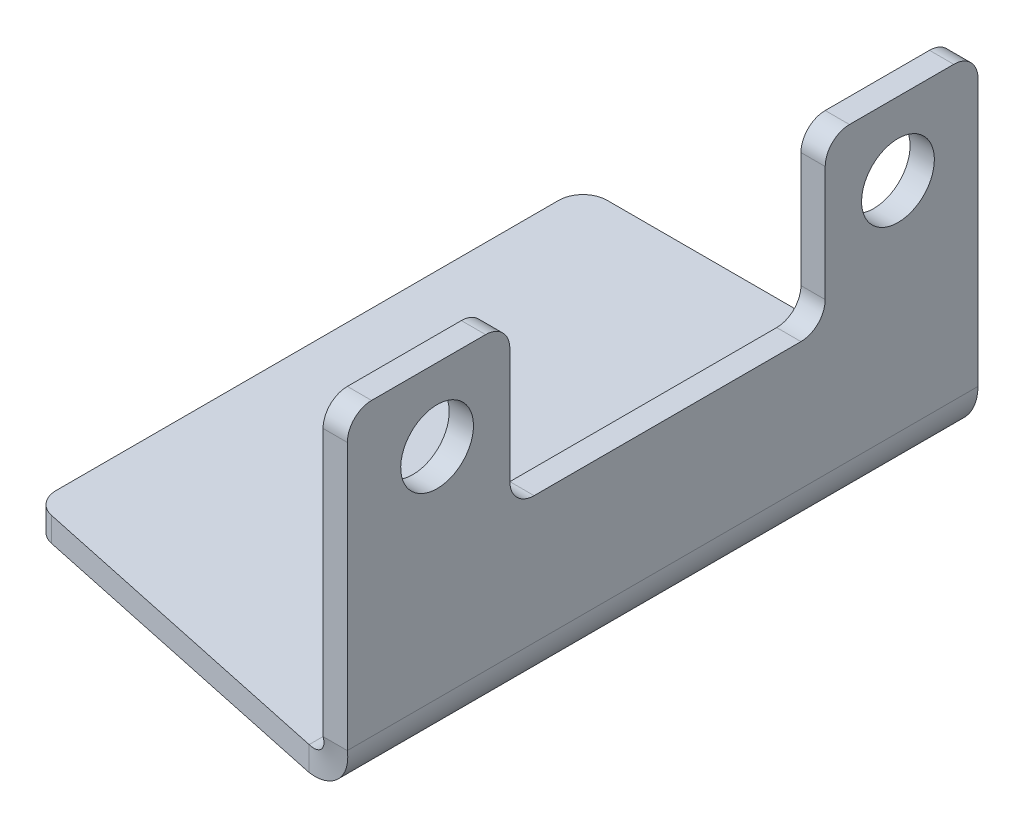
ISO-10303-21;
HEADER;
FILE_DESCRIPTION(('STEP AP214'),'2;1');
FILE_NAME('part.step','',(''),(''),'','','');
FILE_SCHEMA(('AUTOMOTIVE_DESIGN { 1 0 10303 214 1 1 1 1 }'));
ENDSEC;
DATA;
#1=APPLICATION_CONTEXT('core data for automotive mechanical design processes');
#2=APPLICATION_PROTOCOL_DEFINITION('international standard','automotive_design',2000,#1);
#3=PRODUCT_CONTEXT('',#1,'mechanical');
#4=PRODUCT('Part','Part','',(#3));
#5=PRODUCT_RELATED_PRODUCT_CATEGORY('part','',(#4));
#6=PRODUCT_DEFINITION_FORMATION('','',#4);
#7=PRODUCT_DEFINITION_CONTEXT('part definition',#1,'design');
#8=PRODUCT_DEFINITION('design','',#6,#7);
#9=PRODUCT_DEFINITION_SHAPE('','',#8);
#10=(LENGTH_UNIT() NAMED_UNIT(*) SI_UNIT(.MILLI.,.METRE.));
#11=(NAMED_UNIT(*) PLANE_ANGLE_UNIT() SI_UNIT($,.RADIAN.));
#12=(NAMED_UNIT(*) SI_UNIT($,.STERADIAN.) SOLID_ANGLE_UNIT());
#13=UNCERTAINTY_MEASURE_WITH_UNIT(LENGTH_MEASURE(1.E-05),#10,'distance_accuracy_value','');
#14=(GEOMETRIC_REPRESENTATION_CONTEXT(3) GLOBAL_UNCERTAINTY_ASSIGNED_CONTEXT((#13)) GLOBAL_UNIT_ASSIGNED_CONTEXT((#10,
#11,#12)) REPRESENTATION_CONTEXT('',''));
#15=CARTESIAN_POINT('',(0.,0.,0.));
#16=DIRECTION('',(0.,0.,1.));
#17=DIRECTION('',(1.,0.,0.));
#18=AXIS2_PLACEMENT_3D('',#15,#16,#17);
#19=CARTESIAN_POINT('',(54.3420683358524,-2.06531244947266E-13,0.));
#20=DIRECTION('',(-1.,0.,0.));
#21=DIRECTION('',(0.,-1.,0.));
#22=AXIS2_PLACEMENT_3D('',#19,#20,#21);
#23=PLANE('',#22);
#24=CARTESIAN_POINT('',(54.3420683358525,9.99999999999999,28.8693821128302));
#25=DIRECTION('',(-1.,0.,0.));
#26=DIRECTION('',(0.,-1.,0.));
#27=AXIS2_PLACEMENT_3D('',#24,#25,#26);
#28=CIRCLE('',#27,1.5);
#29=CARTESIAN_POINT('',(54.3420683358525,8.49999999999999,28.8693821128302));
#30=VERTEX_POINT('',#29);
#31=EDGE_CURVE('E244',#30,#30,#28,.T.);
#32=ORIENTED_EDGE('',*,*,#31,.T.);
#33=EDGE_LOOP('',(#32));
#34=FACE_BOUND('',#33,.T.);
#35=CARTESIAN_POINT('',(54.3420683358525,9.99999999999999,47.8693821128302));
#36=DIRECTION('',(-1.,0.,0.));
#37=DIRECTION('',(0.,-1.,0.));
#38=AXIS2_PLACEMENT_3D('',#35,#36,#37);
#39=CIRCLE('',#38,1.5);
#40=CARTESIAN_POINT('',(54.3420683358524,8.49999999999998,47.8693821128302));
#41=VERTEX_POINT('',#40);
#42=EDGE_CURVE('E405',#41,#41,#39,.T.);
#43=ORIENTED_EDGE('',*,*,#42,.T.);
#44=EDGE_LOOP('',(#43));
#45=FACE_BOUND('',#44,.T.);
#46=DIRECTION('',(0.,1.,0.));
#47=VECTOR('',#46,1.);
#48=CARTESIAN_POINT('',(54.3420683358524,-20.,25.57));
#49=LINE('',#48,#47);
#50=CARTESIAN_POINT('',(54.3420683358524,0.999999999999991,25.57));
#51=VERTEX_POINT('',#50);
#52=CARTESIAN_POINT('',(54.3420683358525,12.,25.57));
#53=VERTEX_POINT('',#52);
#54=EDGE_CURVE('E204',#51,#53,#49,.T.);
#55=ORIENTED_EDGE('',*,*,#54,.T.);
#56=CARTESIAN_POINT('',(54.3420683358525,12.,26.57));
#57=DIRECTION('',(-1.,0.,0.));
#58=DIRECTION('',(0.,-1.,0.));
#59=AXIS2_PLACEMENT_3D('',#56,#57,#58);
#60=CIRCLE('',#59,1.);
#61=CARTESIAN_POINT('',(54.3420683358525,13.,26.57));
#62=VERTEX_POINT('',#61);
#63=EDGE_CURVE('E362',#53,#62,#60,.F.);
#64=ORIENTED_EDGE('',*,*,#63,.T.);
#65=DIRECTION('',(0.,0.,1.));
#66=VECTOR('',#65,1.);
#67=CARTESIAN_POINT('',(54.3420683358525,13.,0.));
#68=LINE('',#67,#66);
#69=CARTESIAN_POINT('',(54.3420683358525,13.,30.8693821128302));
#70=VERTEX_POINT('',#69);
#71=EDGE_CURVE('E353',#62,#70,#68,.T.);
#72=ORIENTED_EDGE('',*,*,#71,.T.);
#73=CARTESIAN_POINT('',(54.3420683358525,12.,30.8693821128302));
#74=DIRECTION('',(-1.,0.,0.));
#75=DIRECTION('',(0.,-1.,0.));
#76=AXIS2_PLACEMENT_3D('',#73,#74,#75);
#77=CIRCLE('',#76,1.);
#78=CARTESIAN_POINT('',(54.3420683358525,12.,31.8693821128302));
#79=VERTEX_POINT('',#78);
#80=EDGE_CURVE('E463',#70,#79,#77,.F.);
#81=ORIENTED_EDGE('',*,*,#80,.T.);
#82=DIRECTION('',(0.,-1.,0.));
#83=VECTOR('',#82,1.);
#84=CARTESIAN_POINT('',(54.3420683358524,-2.06531244947266E-13,31.8693821128302));
#85=LINE('',#84,#83);
#86=CARTESIAN_POINT('',(54.3420683358524,7.25,31.8693821128302));
#87=VERTEX_POINT('',#86);
#88=EDGE_CURVE('E420',#79,#87,#85,.T.);
#89=ORIENTED_EDGE('',*,*,#88,.T.);
#90=CARTESIAN_POINT('',(54.3420683358524,7.25,32.8693821128302));
#91=DIRECTION('',(-1.,0.,0.));
#92=DIRECTION('',(0.,-1.,0.));
#93=AXIS2_PLACEMENT_3D('',#90,#91,#92);
#94=CIRCLE('',#93,1.);
#95=CARTESIAN_POINT('',(54.3420683358524,6.25,32.8693821128302));
#96=VERTEX_POINT('',#95);
#97=EDGE_CURVE('E486',#87,#96,#94,.T.);
#98=ORIENTED_EDGE('',*,*,#97,.T.);
#99=DIRECTION('',(0.,0.,-1.));
#100=VECTOR('',#99,1.);
#101=CARTESIAN_POINT('',(54.3420683358524,6.25,0.));
#102=LINE('',#101,#100);
#103=CARTESIAN_POINT('',(54.3420683358524,6.25000000000001,43.8693821128302));
#104=VERTEX_POINT('',#103);
#105=EDGE_CURVE('E412',#104,#96,#102,.T.);
#106=ORIENTED_EDGE('',*,*,#105,.F.);
#107=CARTESIAN_POINT('',(54.3420683358524,7.25000000000001,43.8693821128302));
#108=DIRECTION('',(-1.,0.,0.));
#109=DIRECTION('',(0.,-1.,0.));
#110=AXIS2_PLACEMENT_3D('',#107,#108,#109);
#111=CIRCLE('',#110,1.);
#112=CARTESIAN_POINT('',(54.3420683358524,7.25000000000001,44.8693821128302));
#113=VERTEX_POINT('',#112);
#114=EDGE_CURVE('E365',#104,#113,#111,.T.);
#115=ORIENTED_EDGE('',*,*,#114,.T.);
#116=DIRECTION('',(0.,-1.,0.));
#117=VECTOR('',#116,1.);
#118=CARTESIAN_POINT('',(54.3420683358524,-2.06531244947266E-13,44.8693821128302));
#119=LINE('',#118,#117);
#120=CARTESIAN_POINT('',(54.3420683358525,12.,44.8693821128302));
#121=VERTEX_POINT('',#120);
#122=EDGE_CURVE('E417',#121,#113,#119,.T.);
#123=ORIENTED_EDGE('',*,*,#122,.F.);
#124=CARTESIAN_POINT('',(54.3420683358525,12.,45.8693821128302));
#125=DIRECTION('',(-1.,0.,0.));
#126=DIRECTION('',(0.,-1.,0.));
#127=AXIS2_PLACEMENT_3D('',#124,#125,#126);
#128=CIRCLE('',#127,1.);
#129=CARTESIAN_POINT('',(54.3420683358525,13.,45.8693821128302));
#130=VERTEX_POINT('',#129);
#131=EDGE_CURVE('E465',#121,#130,#128,.F.);
#132=ORIENTED_EDGE('',*,*,#131,.T.);
#133=CARTESIAN_POINT('',(54.3420683358525,13.,50.5693821128302));
#134=VERTEX_POINT('',#133);
#135=EDGE_CURVE('E360',#130,#134,#68,.T.);
#136=ORIENTED_EDGE('',*,*,#135,.T.);
#137=CARTESIAN_POINT('',(54.3420683358525,12.,50.5693821128302));
#138=DIRECTION('',(-1.,0.,0.));
#139=DIRECTION('',(0.,-1.,0.));
#140=AXIS2_PLACEMENT_3D('',#137,#138,#139);
#141=CIRCLE('',#140,1.);
#142=CARTESIAN_POINT('',(54.3420683358525,12.,51.5693821128302));
#143=VERTEX_POINT('',#142);
#144=EDGE_CURVE('E376',#134,#143,#141,.F.);
#145=ORIENTED_EDGE('',*,*,#144,.T.);
#146=DIRECTION('',(0.,-1.,0.));
#147=VECTOR('',#146,1.);
#148=CARTESIAN_POINT('',(54.3420683358524,-2.06531244947266E-13,51.5693821128302));
#149=LINE('',#148,#147);
#150=CARTESIAN_POINT('',(54.3420683358524,0.99999999999999,51.5693821128302));
#151=VERTEX_POINT('',#150);
#152=EDGE_CURVE('E230',#143,#151,#149,.T.);
#153=ORIENTED_EDGE('',*,*,#152,.T.);
#154=DIRECTION('',(0.,0.,-1.));
#155=VECTOR('',#154,1.);
#156=CARTESIAN_POINT('',(54.3420683358524,0.99999999999999,51.5693821128302));
#157=LINE('',#156,#155);
#158=EDGE_CURVE('E222',#51,#151,#157,.F.);
#159=ORIENTED_EDGE('',*,*,#158,.F.);
#160=EDGE_LOOP('',(#55,#64,#72,#81,#89,#98,#106,#115,#123,#132,#136,#145,#153,#159));
#161=FACE_BOUND('',#160,.T.);
#162=ADVANCED_FACE('F68',(#34,#45,#161),#23,.F.);
#163=CARTESIAN_POINT('',(53.3420683358524,-2.03039763608423E-13,0.));
#164=DIRECTION('',(-1.,0.,0.));
#165=DIRECTION('',(0.,-1.,0.));
#166=AXIS2_PLACEMENT_3D('',#163,#164,#165);
#167=PLANE('',#166);
#168=CARTESIAN_POINT('',(53.3420683358525,9.99999999999999,28.8693821128302));
#169=DIRECTION('',(-1.,0.,0.));
#170=DIRECTION('',(0.,-1.,0.));
#171=AXIS2_PLACEMENT_3D('',#168,#169,#170);
#172=CIRCLE('',#171,1.5);
#173=CARTESIAN_POINT('',(53.3420683358525,8.49999999999999,28.8693821128302));
#174=VERTEX_POINT('',#173);
#175=EDGE_CURVE('E408',#174,#174,#172,.T.);
#176=ORIENTED_EDGE('',*,*,#175,.F.);
#177=EDGE_LOOP('',(#176));
#178=FACE_BOUND('',#177,.T.);
#179=CARTESIAN_POINT('',(53.3420683358525,9.99999999999999,47.8693821128302));
#180=DIRECTION('',(-1.,0.,0.));
#181=DIRECTION('',(0.,-1.,0.));
#182=AXIS2_PLACEMENT_3D('',#179,#180,#181);
#183=CIRCLE('',#182,1.5);
#184=CARTESIAN_POINT('',(53.3420683358524,8.49999999999999,47.8693821128302));
#185=VERTEX_POINT('',#184);
#186=EDGE_CURVE('E409',#185,#185,#183,.T.);
#187=ORIENTED_EDGE('',*,*,#186,.F.);
#188=EDGE_LOOP('',(#187));
#189=FACE_BOUND('',#188,.T.);
#190=DIRECTION('',(0.,0.,-1.));
#191=VECTOR('',#190,1.);
#192=CARTESIAN_POINT('',(53.3420683358525,13.,51.5693821128302));
#193=LINE('',#192,#191);
#194=CARTESIAN_POINT('',(53.3420683358525,13.,26.57));
#195=VERTEX_POINT('',#194);
#196=CARTESIAN_POINT('',(53.3420683358525,13.,30.8693821128302));
#197=VERTEX_POINT('',#196);
#198=EDGE_CURVE('E235',#195,#197,#193,.F.);
#199=ORIENTED_EDGE('',*,*,#198,.F.);
#200=CARTESIAN_POINT('',(53.3420683358525,12.,26.57));
#201=DIRECTION('',(-1.,0.,0.));
#202=DIRECTION('',(0.,-1.,0.));
#203=AXIS2_PLACEMENT_3D('',#200,#201,#202);
#204=CIRCLE('',#203,1.);
#205=CARTESIAN_POINT('',(53.3420683358525,12.,25.57));
#206=VERTEX_POINT('',#205);
#207=EDGE_CURVE('E363',#195,#206,#204,.T.);
#208=ORIENTED_EDGE('',*,*,#207,.T.);
#209=DIRECTION('',(0.,-1.,0.));
#210=VECTOR('',#209,1.);
#211=CARTESIAN_POINT('',(53.3420683358524,-2.03039763608423E-13,25.57));
#212=LINE('',#211,#210);
#213=CARTESIAN_POINT('',(53.3420683358524,0.999999999999994,25.57));
#214=VERTEX_POINT('',#213);
#215=EDGE_CURVE('E432',#206,#214,#212,.T.);
#216=ORIENTED_EDGE('',*,*,#215,.T.);
#217=DIRECTION('',(0.,0.,-1.));
#218=VECTOR('',#217,1.);
#219=CARTESIAN_POINT('',(53.3420683358524,0.999999999999994,51.5693821128302));
#220=LINE('',#219,#218);
#221=CARTESIAN_POINT('',(53.3420683358524,0.999999999999994,51.5693821128302));
#222=VERTEX_POINT('',#221);
#223=EDGE_CURVE('E232',#222,#214,#220,.T.);
#224=ORIENTED_EDGE('',*,*,#223,.F.);
#225=DIRECTION('',(0.,1.,0.));
#226=VECTOR('',#225,1.);
#227=CARTESIAN_POINT('',(53.3420683358524,0.,51.5693821128302));
#228=LINE('',#227,#226);
#229=CARTESIAN_POINT('',(53.3420683358525,12.,51.5693821128302));
#230=VERTEX_POINT('',#229);
#231=EDGE_CURVE('E395',#230,#222,#228,.F.);
#232=ORIENTED_EDGE('',*,*,#231,.F.);
#233=CARTESIAN_POINT('',(53.3420683358525,12.,50.5693821128302));
#234=DIRECTION('',(-1.,0.,0.));
#235=DIRECTION('',(0.,-1.,0.));
#236=AXIS2_PLACEMENT_3D('',#233,#234,#235);
#237=CIRCLE('',#236,1.);
#238=CARTESIAN_POINT('',(53.3420683358525,13.,50.5693821128302));
#239=VERTEX_POINT('',#238);
#240=EDGE_CURVE('E364',#230,#239,#237,.T.);
#241=ORIENTED_EDGE('',*,*,#240,.T.);
#242=CARTESIAN_POINT('',(53.3420683358525,13.,45.8693821128302));
#243=VERTEX_POINT('',#242);
#244=EDGE_CURVE('E231',#243,#239,#193,.F.);
#245=ORIENTED_EDGE('',*,*,#244,.F.);
#246=CARTESIAN_POINT('',(53.3420683358525,12.,45.8693821128302));
#247=DIRECTION('',(-1.,0.,0.));
#248=DIRECTION('',(0.,-1.,0.));
#249=AXIS2_PLACEMENT_3D('',#246,#247,#248);
#250=CIRCLE('',#249,1.);
#251=CARTESIAN_POINT('',(53.3420683358525,12.,44.8693821128302));
#252=VERTEX_POINT('',#251);
#253=EDGE_CURVE('E472',#243,#252,#250,.T.);
#254=ORIENTED_EDGE('',*,*,#253,.T.);
#255=DIRECTION('',(0.,-1.,0.));
#256=VECTOR('',#255,1.);
#257=CARTESIAN_POINT('',(53.3420683358524,-1.96008152473473E-13,44.8693821128302));
#258=LINE('',#257,#256);
#259=CARTESIAN_POINT('',(53.3420683358524,7.25000000000001,44.8693821128302));
#260=VERTEX_POINT('',#259);
#261=EDGE_CURVE('E226',#252,#260,#258,.T.);
#262=ORIENTED_EDGE('',*,*,#261,.T.);
#263=CARTESIAN_POINT('',(53.3420683358524,7.25000000000001,43.8693821128302));
#264=DIRECTION('',(-1.,0.,0.));
#265=DIRECTION('',(0.,-1.,0.));
#266=AXIS2_PLACEMENT_3D('',#263,#264,#265);
#267=CIRCLE('',#266,1.);
#268=CARTESIAN_POINT('',(53.3420683358524,6.25000000000001,43.8693821128302));
#269=VERTEX_POINT('',#268);
#270=EDGE_CURVE('E368',#260,#269,#267,.F.);
#271=ORIENTED_EDGE('',*,*,#270,.T.);
#272=DIRECTION('',(0.,0.,-1.));
#273=VECTOR('',#272,1.);
#274=CARTESIAN_POINT('',(53.3420683358524,6.25,0.));
#275=LINE('',#274,#273);
#276=CARTESIAN_POINT('',(53.3420683358524,6.25000000000001,32.8693821128302));
#277=VERTEX_POINT('',#276);
#278=EDGE_CURVE('E423',#269,#277,#275,.T.);
#279=ORIENTED_EDGE('',*,*,#278,.T.);
#280=CARTESIAN_POINT('',(53.3420683358524,7.25000000000001,32.8693821128302));
#281=DIRECTION('',(-1.,0.,0.));
#282=DIRECTION('',(0.,-1.,0.));
#283=AXIS2_PLACEMENT_3D('',#280,#281,#282);
#284=CIRCLE('',#283,1.);
#285=CARTESIAN_POINT('',(53.3420683358524,7.25000000000001,31.8693821128302));
#286=VERTEX_POINT('',#285);
#287=EDGE_CURVE('E484',#277,#286,#284,.F.);
#288=ORIENTED_EDGE('',*,*,#287,.T.);
#289=DIRECTION('',(0.,-1.,0.));
#290=VECTOR('',#289,1.);
#291=CARTESIAN_POINT('',(53.3420683358524,-1.96008152473473E-13,31.8693821128302));
#292=LINE('',#291,#290);
#293=CARTESIAN_POINT('',(53.3420683358525,12.,31.8693821128302));
#294=VERTEX_POINT('',#293);
#295=EDGE_CURVE('E426',#294,#286,#292,.T.);
#296=ORIENTED_EDGE('',*,*,#295,.F.);
#297=CARTESIAN_POINT('',(53.3420683358525,12.,30.8693821128302));
#298=DIRECTION('',(-1.,0.,0.));
#299=DIRECTION('',(0.,-1.,0.));
#300=AXIS2_PLACEMENT_3D('',#297,#298,#299);
#301=CIRCLE('',#300,1.);
#302=EDGE_CURVE('E469',#294,#197,#301,.T.);
#303=ORIENTED_EDGE('',*,*,#302,.T.);
#304=EDGE_LOOP('',(#199,#208,#216,#224,#232,#241,#245,#254,#262,#271,#279,#288,#296,#303));
#305=FACE_BOUND('',#304,.T.);
#306=ADVANCED_FACE('F285',(#178,#189,#305),#167,.T.);
#307=CARTESIAN_POINT('',(0.,-1.,0.));
#308=DIRECTION('',(0.,-1.,0.));
#309=DIRECTION('',(0.,0.,-1.));
#310=AXIS2_PLACEMENT_3D('',#307,#308,#309);
#311=PLANE('',#310);
#312=DIRECTION('',(0.,0.,1.));
#313=VECTOR('',#312,1.);
#314=CARTESIAN_POINT('',(38.0558663949796,-1.,0.));
#315=LINE('',#314,#313);
#316=CARTESIAN_POINT('',(38.0558663949796,-1.,26.57));
#317=VERTEX_POINT('',#316);
#318=CARTESIAN_POINT('',(38.0558663949796,-1.,47.292550277598));
#319=VERTEX_POINT('',#318);
#320=EDGE_CURVE('E452',#317,#319,#315,.T.);
#321=ORIENTED_EDGE('',*,*,#320,.F.);
#322=CARTESIAN_POINT('',(39.0558663949796,-1.,26.57));
#323=DIRECTION('',(0.,-1.,0.));
#324=DIRECTION('',(0.,0.,-1.));
#325=AXIS2_PLACEMENT_3D('',#322,#323,#324);
#326=CIRCLE('',#325,1.);
#327=CARTESIAN_POINT('',(39.0558663949796,-1.,25.57));
#328=VERTEX_POINT('',#327);
#329=EDGE_CURVE('E387',#317,#328,#326,.T.);
#330=ORIENTED_EDGE('',*,*,#329,.T.);
#331=DIRECTION('',(1.,0.,0.));
#332=VECTOR('',#331,1.);
#333=CARTESIAN_POINT('',(0.,-1.,25.57));
#334=LINE('',#333,#332);
#335=CARTESIAN_POINT('',(52.3420683358524,-1.,25.57));
#336=VERTEX_POINT('',#335);
#337=EDGE_CURVE('E227',#328,#336,#334,.T.);
#338=ORIENTED_EDGE('',*,*,#337,.T.);
#339=DIRECTION('',(0.,0.,-1.));
#340=VECTOR('',#339,1.);
#341=CARTESIAN_POINT('',(52.3420683358524,-1.,0.));
#342=LINE('',#341,#340);
#343=CARTESIAN_POINT('',(52.3420683358524,-1.,51.1435837408828));
#344=VERTEX_POINT('',#343);
#345=EDGE_CURVE('E225',#336,#344,#342,.F.);
#346=ORIENTED_EDGE('',*,*,#345,.T.);
#347=DIRECTION('',(0.978079396659026,0.,0.208232307366355));
#348=VECTOR('',#347,1.);
#349=CARTESIAN_POINT('',(38.0558663949796,-1.,48.1020629770151));
#350=LINE('',#349,#348);
#351=CARTESIAN_POINT('',(38.8476340876133,-1.,48.2706296742571));
#352=VERTEX_POINT('',#351);
#353=EDGE_CURVE('E445',#352,#344,#350,.T.);
#354=ORIENTED_EDGE('',*,*,#353,.F.);
#355=CARTESIAN_POINT('',(39.0558663949796,-1.,47.292550277598));
#356=DIRECTION('',(0.,-1.,0.));
#357=DIRECTION('',(0.,0.,-1.));
#358=AXIS2_PLACEMENT_3D('',#355,#356,#357);
#359=CIRCLE('',#358,1.);
#360=EDGE_CURVE('E385',#352,#319,#359,.T.);
#361=ORIENTED_EDGE('',*,*,#360,.T.);
#362=EDGE_LOOP('',(#321,#330,#338,#346,#354,#361));
#363=FACE_BOUND('',#362,.T.);
#364=ADVANCED_FACE('F276',(#363),#311,.T.);
#365=CARTESIAN_POINT('',(0.,0.,0.));
#366=DIRECTION('',(0.,-1.,0.));
#367=DIRECTION('',(0.,0.,-1.));
#368=AXIS2_PLACEMENT_3D('',#365,#366,#367);
#369=PLANE('',#368);
#370=DIRECTION('',(1.,0.,0.));
#371=VECTOR('',#370,1.);
#372=CARTESIAN_POINT('',(0.,0.,25.57));
#373=LINE('',#372,#371);
#374=CARTESIAN_POINT('',(39.0558663949796,0.,25.57));
#375=VERTEX_POINT('',#374);
#376=CARTESIAN_POINT('',(52.3420683358524,0.,25.57));
#377=VERTEX_POINT('',#376);
#378=EDGE_CURVE('E434',#375,#377,#373,.T.);
#379=ORIENTED_EDGE('',*,*,#378,.F.);
#380=CARTESIAN_POINT('',(39.0558663949796,0.,26.57));
#381=DIRECTION('',(0.,-1.,0.));
#382=DIRECTION('',(0.,0.,-1.));
#383=AXIS2_PLACEMENT_3D('',#380,#381,#382);
#384=CIRCLE('',#383,1.);
#385=CARTESIAN_POINT('',(38.0558663949796,0.,26.57));
#386=VERTEX_POINT('',#385);
#387=EDGE_CURVE('E390',#375,#386,#384,.F.);
#388=ORIENTED_EDGE('',*,*,#387,.T.);
#389=DIRECTION('',(0.,0.,1.));
#390=VECTOR('',#389,1.);
#391=CARTESIAN_POINT('',(38.0558663949796,0.,0.));
#392=LINE('',#391,#390);
#393=CARTESIAN_POINT('',(38.0558663949796,0.,47.292550277598));
#394=VERTEX_POINT('',#393);
#395=EDGE_CURVE('E446',#386,#394,#392,.T.);
#396=ORIENTED_EDGE('',*,*,#395,.T.);
#397=CARTESIAN_POINT('',(39.0558663949796,0.,47.292550277598));
#398=DIRECTION('',(0.,-1.,0.));
#399=DIRECTION('',(0.,0.,-1.));
#400=AXIS2_PLACEMENT_3D('',#397,#398,#399);
#401=CIRCLE('',#400,1.);
#402=CARTESIAN_POINT('',(38.8476340876133,0.,48.2706296742571));
#403=VERTEX_POINT('',#402);
#404=EDGE_CURVE('E83',#394,#403,#401,.F.);
#405=ORIENTED_EDGE('',*,*,#404,.T.);
#406=DIRECTION('',(0.978079396659026,0.,0.208232307366355));
#407=VECTOR('',#406,1.);
#408=CARTESIAN_POINT('',(38.0558663949796,0.,48.1020629770151));
#409=LINE('',#408,#407);
#410=CARTESIAN_POINT('',(52.3420683358524,0.,51.1435837408828));
#411=VERTEX_POINT('',#410);
#412=EDGE_CURVE('E444',#403,#411,#409,.T.);
#413=ORIENTED_EDGE('',*,*,#412,.T.);
#414=DIRECTION('',(0.,0.,-1.));
#415=VECTOR('',#414,1.);
#416=CARTESIAN_POINT('',(52.3420683358524,0.,0.));
#417=LINE('',#416,#415);
#418=EDGE_CURVE('E245',#377,#411,#417,.F.);
#419=ORIENTED_EDGE('',*,*,#418,.F.);
#420=EDGE_LOOP('',(#379,#388,#396,#405,#413,#419));
#421=FACE_BOUND('',#420,.T.);
#422=ADVANCED_FACE('F284',(#421),#369,.F.);
#423=CARTESIAN_POINT('',(38.0558663949796,-1.,0.));
#424=DIRECTION('',(-1.,0.,0.));
#425=DIRECTION('',(0.,0.,1.));
#426=AXIS2_PLACEMENT_3D('',#423,#424,#425);
#427=PLANE('',#426);
#428=ORIENTED_EDGE('',*,*,#395,.F.);
#429=DIRECTION('',(0.,-1.,0.));
#430=VECTOR('',#429,1.);
#431=CARTESIAN_POINT('',(38.0558663949796,-1.,26.57));
#432=LINE('',#431,#430);
#433=EDGE_CURVE('E382',#386,#317,#432,.T.);
#434=ORIENTED_EDGE('',*,*,#433,.T.);
#435=ORIENTED_EDGE('',*,*,#320,.T.);
#436=DIRECTION('',(0.,1.,0.));
#437=VECTOR('',#436,1.);
#438=CARTESIAN_POINT('',(38.0558663949796,-1.,47.292550277598));
#439=LINE('',#438,#437);
#440=EDGE_CURVE('E379',#319,#394,#439,.T.);
#441=ORIENTED_EDGE('',*,*,#440,.T.);
#442=EDGE_LOOP('',(#428,#434,#435,#441));
#443=FACE_BOUND('',#442,.T.);
#444=ADVANCED_FACE('F289',(#443),#427,.T.);
#445=CARTESIAN_POINT('',(52.3420683358524,0.999999999999998,0.));
#446=DIRECTION('',(0.,0.,-1.));
#447=DIRECTION('',(1.,0.,0.));
#448=AXIS2_PLACEMENT_3D('',#445,#446,#447);
#449=CYLINDRICAL_SURFACE('',#448,2.);
#450=ORIENTED_EDGE('',*,*,#345,.F.);
#451=CARTESIAN_POINT('',(52.3420683358524,0.999999999999998,25.57));
#452=DIRECTION('',(0.,0.,-1.));
#453=DIRECTION('',(-1.,0.,0.));
#454=AXIS2_PLACEMENT_3D('',#451,#452,#453);
#455=CIRCLE('',#454,2.);
#456=EDGE_CURVE('E209',#336,#51,#455,.F.);
#457=ORIENTED_EDGE('',*,*,#456,.T.);
#458=ORIENTED_EDGE('',*,*,#158,.T.);
#459=CARTESIAN_POINT('',(52.3420683358524,-1.,51.1435837408828));
#460=CARTESIAN_POINT('',(52.3747932923742,-1.00000069417755,51.1480191405906));
#461=CARTESIAN_POINT('',(52.4075181898283,-0.999196834250309,51.1524545402984));
#462=CARTESIAN_POINT('',(52.4728891791862,-0.995984990570387,51.1613253397139));
#463=CARTESIAN_POINT('',(52.5055352710901,-0.993577006817711,51.1657607394217));
#464=CARTESIAN_POINT('',(52.5706699619329,-0.987161899871083,51.1746315388373));
#465=CARTESIAN_POINT('',(52.6031585608719,-0.983154776677132,51.1790669385451));
#466=CARTESIAN_POINT('',(52.6679000086544,-0.973551263181998,51.1879377379607));
#467=CARTESIAN_POINT('',(52.700152857498,-0.967954872880815,51.1923731376684));
#468=CARTESIAN_POINT('',(52.7643451022714,-0.955186248732114,51.201243937084));
#469=CARTESIAN_POINT('',(52.7962844982012,-0.948014014884597,51.2056793367918));
#470=CARTESIAN_POINT('',(52.8597728931167,-0.932110997893586,51.2145501362074));
#471=CARTESIAN_POINT('',(52.8913218921023,-0.923380214750093,51.2189855359152));
#472=CARTESIAN_POINT('',(52.9539534886204,-0.90438112817875,51.2278563353307));
#473=CARTESIAN_POINT('',(52.985036086153,-0.8941128247509,51.2322917350385));
#474=CARTESIAN_POINT('',(53.0466599991207,-0.872063435981188,51.2411625344541));
#475=CARTESIAN_POINT('',(53.0772013145557,-0.860282350639326,51.2455979341619));
#476=CARTESIAN_POINT('',(53.1376690866095,-0.83523577940583,51.2544687335774));
#477=CARTESIAN_POINT('',(53.1675955432281,-0.821970293514197,51.2589041332852));
#478=CARTESIAN_POINT('',(53.2267615021978,-0.793986878979583,51.2677749327008));
#479=CARTESIAN_POINT('',(53.2560010045489,-0.779268950336602,51.2722103324086));
#480=CARTESIAN_POINT('',(53.31372261446,-0.748416107056828,51.2810811318241));
#481=CARTESIAN_POINT('',(53.34220472202,-0.732281192420034,51.2855165315319));
#482=CARTESIAN_POINT('',(53.3983429264577,-0.698633247581062,51.2943873309475));
#483=CARTESIAN_POINT('',(53.4259990233352,-0.681120217378885,51.2988227306553));
#484=CARTESIAN_POINT('',(53.480418580448,-0.644758231831305,51.3076935300709));
#485=CARTESIAN_POINT('',(53.5071820406832,-0.625909276485902,51.3121289297787));
#486=CARTESIAN_POINT('',(53.5597518489914,-0.586920849436688,51.3209997291942));
#487=CARTESIAN_POINT('',(53.5855581970643,-0.566781377732877,51.325435128902));
#488=CARTESIAN_POINT('',(53.6361516112951,-0.525260435718081,51.3343059283176));
#489=CARTESIAN_POINT('',(53.6609386774529,-0.503878965407095,51.3387413280254));
#490=CARTESIAN_POINT('',(53.70943381364,-0.459925536012752,51.3476121274409));
#491=CARTESIAN_POINT('',(53.7331418836692,-0.437353576929395,51.3520475271487));
#492=CARTESIAN_POINT('',(53.7794219127818,-0.391073547816805,51.3609183265643));
#493=CARTESIAN_POINT('',(53.8019938718652,-0.367365477787573,51.3653537262721));
#494=CARTESIAN_POINT('',(53.8459473012595,-0.318870341600514,51.3742245256876));
#495=CARTESIAN_POINT('',(53.8673287715705,-0.294083275442687,51.3786599253954));
#496=CARTESIAN_POINT('',(53.9088497135853,-0.243489861211907,51.387530724811));
#497=CARTESIAN_POINT('',(53.9289891852891,-0.217683513138952,51.3919661245188));
#498=CARTESIAN_POINT('',(53.9679776123383,-0.165113704830795,51.4008369239344));
#499=CARTESIAN_POINT('',(53.9868265676837,-0.138350244595592,51.4052723236421));
#500=CARTESIAN_POINT('',(54.0231885532313,-0.0839306874828294,51.4141431230577));
#501=CARTESIAN_POINT('',(54.0407015834335,-0.0562745906052693,51.4185785227655));
#502=CARTESIAN_POINT('',(54.0743495282724,-0.000136386167631906,51.4274493221811));
#503=CARTESIAN_POINT('',(54.0904844429092,0.0283457213924454,51.4318847218888));
#504=CARTESIAN_POINT('',(54.121337286189,0.0860673313035505,51.4407555213044));
#505=CARTESIAN_POINT('',(54.136055214832,0.115306833654578,51.4451909210122));
#506=CARTESIAN_POINT('',(54.1640386293666,0.174472792624278,51.4540617204278));
#507=CARTESIAN_POINT('',(54.1773041152583,0.20439924924295,51.4584971201356));
#508=CARTESIAN_POINT('',(54.2023506864917,0.264867021296675,51.4673679195511));
#509=CARTESIAN_POINT('',(54.2141317718336,0.295408336731727,51.4718033192589));
#510=CARTESIAN_POINT('',(54.2361811606033,0.357032249699377,51.4806741186745));
#511=CARTESIAN_POINT('',(54.2464494640312,0.388114847231974,51.4851095183823));
#512=CARTESIAN_POINT('',(54.2654485506025,0.450746443750159,51.4939803177978));
#513=CARTESIAN_POINT('',(54.274179333746,0.482295442735747,51.4984157175056));
#514=CARTESIAN_POINT('',(54.290082350737,0.54578383765118,51.5072865169212));
#515=CARTESIAN_POINT('',(54.2972545845845,0.577723233581026,51.511721916629));
#516=CARTESIAN_POINT('',(54.3100232087332,0.641915478354443,51.5205927160446));
#517=CARTESIAN_POINT('',(54.3156195990344,0.674168327198014,51.5250281157523));
#518=CARTESIAN_POINT('',(54.3252231125295,0.73890977498052,51.5338989151679));
#519=CARTESIAN_POINT('',(54.3292302357235,0.771398373919457,51.5383343148757));
#520=CARTESIAN_POINT('',(54.3356453426701,0.836533064762283,51.5472051142913));
#521=CARTESIAN_POINT('',(54.3380533264228,0.869179156666172,51.5516405139991));
#522=CARTESIAN_POINT('',(54.3412651701027,0.934550146024136,51.5605113134146));
#523=CARTESIAN_POINT('',(54.34206903003,0.96727504347821,51.5649467131224));
#524=CARTESIAN_POINT('',(54.3420683358524,0.99999999999999,51.5693821128302));
#525=B_SPLINE_CURVE_WITH_KNOTS('',3,(#459,#460,#461,#462,#463,#464,#465,#466,#467,#468,#469,
#470,#471,#472,#473,#474,#475,#476,#477,#478,#479,#480,#481,#482,#483,#484,#485,#486,#487,#488,
#489,#490,#491,#492,#493,#494,#495,#496,#497,#498,#499,#500,#501,#502,#503,#504,#505,#506,#507,
#508,#509,#510,#511,#512,#513,#514,#515,#516,#517,#518,#519,#520,#521,#522,#523,#524),
.UNSPECIFIED.,.F.,.F.,(4,2,2,2,2,2,2,2,2,2,2,2,2,2,2,2,2,2,2,2,2,2,2,2,2,2,2,2,2,2,2,2,4),(0.,
0.0990626331859329,0.198125266371869,0.297187899557806,0.396250532743741,0.495313165929676,
0.594375799115615,0.693438432301546,0.792501065487486,0.891563698673418,0.990626331859358,
1.08968896504529,1.18875159823123,1.28781423141716,1.3868768646031,1.48593949778903,
1.58500213097497,1.68406476416091,1.78312739734684,1.88219003053278,1.98125266371871,
2.08031529690465,2.17937793009058,2.27844056327652,2.37750319646245,2.47656582964839,
2.57562846283433,2.67469109602026,2.7737537292062,2.87281636239213,2.97187899557807,
3.070941628764,3.17000426194994),.UNSPECIFIED.);
#526=EDGE_CURVE('E447',#344,#151,#525,.T.);
#527=ORIENTED_EDGE('',*,*,#526,.F.);
#528=EDGE_LOOP('',(#450,#457,#458,#527));
#529=FACE_BOUND('',#528,.T.);
#530=ADVANCED_FACE('F220',(#529),#449,.T.);
#531=CARTESIAN_POINT('',(52.3420683358524,0.999999999999998,0.));
#532=DIRECTION('',(0.,0.,-1.));
#533=DIRECTION('',(1.,0.,0.));
#534=AXIS2_PLACEMENT_3D('',#531,#532,#533);
#535=CYLINDRICAL_SURFACE('',#534,1.);
#536=CARTESIAN_POINT('',(52.3420683358524,0.999999999999998,25.57));
#537=DIRECTION('',(0.,0.,-1.));
#538=DIRECTION('',(-1.,0.,0.));
#539=AXIS2_PLACEMENT_3D('',#536,#537,#538);
#540=CIRCLE('',#539,1.);
#541=EDGE_CURVE('E216',#377,#214,#540,.F.);
#542=ORIENTED_EDGE('',*,*,#541,.F.);
#543=ORIENTED_EDGE('',*,*,#418,.T.);
#544=CARTESIAN_POINT('',(52.3420683358524,0.,51.1435837408828));
#545=CARTESIAN_POINT('',(52.3584308141133,-3.47088778292276E-07,51.1480191405906));
#546=CARTESIAN_POINT('',(52.3747932628403,0.000401582874844019,51.1524545402984));
#547=CARTESIAN_POINT('',(52.4074787575193,0.00200750471480466,51.1613253397139));
#548=CARTESIAN_POINT('',(52.4238018034713,0.00321149659114293,51.1657607394217));
#549=CARTESIAN_POINT('',(52.4563691488927,0.00641905006445684,51.1746315388373));
#550=CARTESIAN_POINT('',(52.4726134483622,0.00842261166143249,51.1790669385451));
#551=CARTESIAN_POINT('',(52.5049841722534,0.0132243684089994,51.1879377379607));
#552=CARTESIAN_POINT('',(52.5211105966752,0.0160225635595908,51.1923731376684));
#553=CARTESIAN_POINT('',(52.5532067190619,0.0224068756339413,51.201243937084));
#554=CARTESIAN_POINT('',(52.5691764170268,0.0259929925577004,51.2056793367918));
#555=CARTESIAN_POINT('',(52.6009206144845,0.0339445010532055,51.2145501362074));
#556=CARTESIAN_POINT('',(52.6166951139773,0.0383098926249517,51.2189855359152));
#557=CARTESIAN_POINT('',(52.6480109122364,0.0478094359106231,51.2278563353307));
#558=CARTESIAN_POINT('',(52.6635522110027,0.0529435876245482,51.2322917350385));
#559=CARTESIAN_POINT('',(52.6943641674866,0.0639682820094044,51.2411625344541));
#560=CARTESIAN_POINT('',(52.7096348252041,0.0698588246803357,51.2455979341619));
#561=CARTESIAN_POINT('',(52.7398687112309,0.0823821102970832,51.2544687335774));
#562=CARTESIAN_POINT('',(52.7548319395403,0.0890148532428994,51.2589041332852));
#563=CARTESIAN_POINT('',(52.7844149190251,0.103006560510207,51.2677749327008));
#564=CARTESIAN_POINT('',(52.7990346702006,0.110365524831698,51.2722103324086));
#565=CARTESIAN_POINT('',(52.8278954751562,0.125791946471585,51.2810811318241));
#566=CARTESIAN_POINT('',(52.8421365289362,0.133859403789981,51.2855165315319));
#567=CARTESIAN_POINT('',(52.8702056311551,0.150683376209466,51.2943873309475));
#568=CARTESIAN_POINT('',(52.8840336795938,0.159439891310555,51.2988227306553));
#569=CARTESIAN_POINT('',(52.9112434581502,0.177620884084347,51.3076935300709));
#570=CARTESIAN_POINT('',(52.9246251882678,0.187045361757049,51.3121289297787));
#571=CARTESIAN_POINT('',(52.9509100924219,0.206539575281655,51.3209997291942));
#572=CARTESIAN_POINT('',(52.9638132664584,0.216609311133559,51.325435128902));
#573=CARTESIAN_POINT('',(52.9891099735738,0.237369782140957,51.3343059283176));
#574=CARTESIAN_POINT('',(53.0015035066527,0.248060517296451,51.3387413280254));
#575=CARTESIAN_POINT('',(53.0257510747462,0.270037231993623,51.3476121274409));
#576=CARTESIAN_POINT('',(53.0376051097608,0.281323211535301,51.3520475271487));
#577=CARTESIAN_POINT('',(53.0607451243171,0.304463226091595,51.3609183265643));
#578=CARTESIAN_POINT('',(53.0720311038588,0.316317261106212,51.3653537262721));
#579=CARTESIAN_POINT('',(53.094007818556,0.340564829199742,51.3742245256876));
#580=CARTESIAN_POINT('',(53.1046985537115,0.352958362278656,51.3786599253954));
#581=CARTESIAN_POINT('',(53.1254590247189,0.378255069394046,51.387530724811));
#582=CARTESIAN_POINT('',(53.1355287605708,0.391158243430522,51.3919661245188));
#583=CARTESIAN_POINT('',(53.1550229740954,0.417443147584601,51.4008369239344));
#584=CARTESIAN_POINT('',(53.1644474517681,0.430824877702202,51.4052723236421));
#585=CARTESIAN_POINT('',(53.1826284445419,0.458034656258584,51.4141431230577));
#586=CARTESIAN_POINT('',(53.191384959643,0.471862704697364,51.4185785227655));
#587=CARTESIAN_POINT('',(53.2082089320624,0.499931806916183,51.4274493221811));
#588=CARTESIAN_POINT('',(53.2162763893808,0.514172860696221,51.4318847218888));
#589=CARTESIAN_POINT('',(53.2317028110207,0.543033665651774,51.4407555213044));
#590=CARTESIAN_POINT('',(53.2390617753422,0.557653416827288,51.4451909210122));
#591=CARTESIAN_POINT('',(53.2530534826095,0.587236396312138,51.4540617204278));
#592=CARTESIAN_POINT('',(53.2596862255553,0.602199624621474,51.4584971201356));
#593=CARTESIAN_POINT('',(53.2722095111721,0.632433510648336,51.4673679195511));
#594=CARTESIAN_POINT('',(53.278100053843,0.647704168365862,51.4718033192589));
#595=CARTESIAN_POINT('',(53.2891247482279,0.678516124849687,51.4806741186745));
#596=CARTESIAN_POINT('',(53.2942588999418,0.694057423615986,51.4851095183823));
#597=CARTESIAN_POINT('',(53.3037584432275,0.725373221875078,51.4939803177978));
#598=CARTESIAN_POINT('',(53.3081238347992,0.741147721367872,51.4984157175056));
#599=CARTESIAN_POINT('',(53.3160753432947,0.772891918825589,51.5072865169212));
#600=CARTESIAN_POINT('',(53.3196614602185,0.788861616790512,51.511721916629));
#601=CARTESIAN_POINT('',(53.3260457722928,0.82095773917722,51.5205927160446));
#602=CARTESIAN_POINT('',(53.3288439674434,0.837084163599005,51.5250281157523));
#603=CARTESIAN_POINT('',(53.333645724191,0.869454887490259,51.5338989151679));
#604=CARTESIAN_POINT('',(53.335649285788,0.885699186959727,51.5383343148757));
#605=CARTESIAN_POINT('',(53.3388568392613,0.918266532381141,51.5472051142913));
#606=CARTESIAN_POINT('',(53.3400608311376,0.934589578333085,51.5516405139991));
#607=CARTESIAN_POINT('',(53.3416667529776,0.967275073012066,51.5605113134146));
#608=CARTESIAN_POINT('',(53.3420686829412,0.983637521739103,51.5649467131224));
#609=CARTESIAN_POINT('',(53.3420683358524,0.999999999999994,51.5693821128302));
#610=B_SPLINE_CURVE_WITH_KNOTS('',3,(#544,#545,#546,#547,#548,#549,#550,#551,#552,#553,#554,
#555,#556,#557,#558,#559,#560,#561,#562,#563,#564,#565,#566,#567,#568,#569,#570,#571,#572,#573,
#574,#575,#576,#577,#578,#579,#580,#581,#582,#583,#584,#585,#586,#587,#588,#589,#590,#591,#592,
#593,#594,#595,#596,#597,#598,#599,#600,#601,#602,#603,#604,#605,#606,#607,#608,#609),
.UNSPECIFIED.,.F.,.F.,(4,2,2,2,2,2,2,2,2,2,2,2,2,2,2,2,2,2,2,2,2,2,2,2,2,2,2,2,2,2,2,2,4),(0.,
0.0508541298693211,0.101708259738639,0.152562389607957,0.203416519477281,0.254270649346596,
0.305124779215918,0.355978909085233,0.406833038954556,0.457687168823874,0.508541298693192,
0.559395428562516,0.610249558431832,0.66110368830115,0.711957818170474,0.76281194803979,
0.81366607790911,0.864520207778431,0.915374337647748,0.96622846751707,1.01708259738639,
1.06793672725571,1.11879085712503,1.16964498699435,1.22049911686367,1.27135324673299,
1.32220737660231,1.37306150647162,1.42391563634094,1.47476976621026,1.52562389607958,
1.5764780259489,1.62733215581822),.UNSPECIFIED.);
#611=EDGE_CURVE('E248',#411,#222,#610,.T.);
#612=ORIENTED_EDGE('',*,*,#611,.T.);
#613=ORIENTED_EDGE('',*,*,#223,.T.);
#614=EDGE_LOOP('',(#542,#543,#612,#613));
#615=FACE_BOUND('',#614,.T.);
#616=ADVANCED_FACE('F254',(#615),#535,.F.);
#617=CARTESIAN_POINT('',(54.3420683358525,13.,51.5693821128302));
#618=DIRECTION('',(0.,-1.,0.));
#619=DIRECTION('',(1.,0.,0.));
#620=AXIS2_PLACEMENT_3D('',#617,#618,#619);
#621=PLANE('',#620);
#622=ORIENTED_EDGE('',*,*,#71,.F.);
#623=DIRECTION('',(-1.,0.,0.));
#624=VECTOR('',#623,1.);
#625=CARTESIAN_POINT('',(53.3420683358525,13.,26.57));
#626=LINE('',#625,#624);
#627=EDGE_CURVE('E355',#62,#195,#626,.T.);
#628=ORIENTED_EDGE('',*,*,#627,.T.);
#629=ORIENTED_EDGE('',*,*,#198,.T.);
#630=DIRECTION('',(1.,0.,0.));
#631=VECTOR('',#630,1.);
#632=CARTESIAN_POINT('',(54.3420683358525,13.,30.8693821128302));
#633=LINE('',#632,#631);
#634=EDGE_CURVE('E358',#197,#70,#633,.T.);
#635=ORIENTED_EDGE('',*,*,#634,.T.);
#636=EDGE_LOOP('',(#622,#628,#629,#635));
#637=FACE_BOUND('',#636,.T.);
#638=ADVANCED_FACE('F264',(#637),#621,.F.);
#639=ORIENTED_EDGE('',*,*,#244,.T.);
#640=DIRECTION('',(-1.,0.,0.));
#641=VECTOR('',#640,1.);
#642=CARTESIAN_POINT('',(54.3420683358525,13.,50.5693821128302));
#643=LINE('',#642,#641);
#644=EDGE_CURVE('E13',#239,#134,#643,.F.);
#645=ORIENTED_EDGE('',*,*,#644,.T.);
#646=ORIENTED_EDGE('',*,*,#135,.F.);
#647=DIRECTION('',(1.,0.,0.));
#648=VECTOR('',#647,1.);
#649=CARTESIAN_POINT('',(53.3420683358525,13.,45.8693821128302));
#650=LINE('',#649,#648);
#651=EDGE_CURVE('E467',#130,#243,#650,.F.);
#652=ORIENTED_EDGE('',*,*,#651,.T.);
#653=EDGE_LOOP('',(#639,#645,#646,#652));
#654=FACE_BOUND('',#653,.T.);
#655=ADVANCED_FACE('F292',(#654),#621,.F.);
#656=CARTESIAN_POINT('',(38.0558663949796,-1.,48.1020629770151));
#657=DIRECTION('',(-0.208232307366355,0.,0.978079396659026));
#658=DIRECTION('',(0.978079396659026,0.,0.208232307366355));
#659=AXIS2_PLACEMENT_3D('',#656,#657,#658);
#660=PLANE('',#659);
#661=ORIENTED_EDGE('',*,*,#412,.F.);
#662=DIRECTION('',(0.,1.,0.));
#663=VECTOR('',#662,1.);
#664=CARTESIAN_POINT('',(38.8476340876133,-1.,48.2706296742571));
#665=LINE('',#664,#663);
#666=EDGE_CURVE('E90',#403,#352,#665,.F.);
#667=ORIENTED_EDGE('',*,*,#666,.T.);
#668=ORIENTED_EDGE('',*,*,#353,.T.);
#669=DIRECTION('',(0.,-1.,0.));
#670=VECTOR('',#669,1.);
#671=CARTESIAN_POINT('',(52.3420683358524,0.,51.1435837408828));
#672=LINE('',#671,#670);
#673=EDGE_CURVE('E443',#411,#344,#672,.T.);
#674=ORIENTED_EDGE('',*,*,#673,.F.);
#675=EDGE_LOOP('',(#661,#667,#668,#674));
#676=FACE_BOUND('',#675,.T.);
#677=ADVANCED_FACE('F274',(#676),#660,.T.);
#678=CARTESIAN_POINT('',(52.3420683358524,-1.01,51.1435837408828));
#679=CARTESIAN_POINT('',(52.6052233145036,-1.01,51.1790732238918));
#680=CARTESIAN_POINT('',(52.8681815834146,-0.957685080103318,51.2145501362074));
#681=CARTESIAN_POINT('',(53.3543424863979,-0.756310640592062,51.2855165315319));
#682=CARTESIAN_POINT('',(53.577307243002,-0.607330353220348,51.3209997291942));
#683=CARTESIAN_POINT('',(53.9493986890728,-0.235238907149586,51.3919661245188));
#684=CARTESIAN_POINT('',(54.0983789764445,-0.0122741505455143,51.4274493221811));
#685=CARTESIAN_POINT('',(54.2997534159557,0.473886752437838,51.4984157175056));
#686=CARTESIAN_POINT('',(54.3520683358524,0.736845021348787,51.5338926298212));
#687=CARTESIAN_POINT('',(54.3520683358524,0.99999999999999,51.5693821128302));
#688=CARTESIAN_POINT('',(52.3420683358524,-1.,51.1435837408828));
#689=CARTESIAN_POINT('',(52.6039140739158,-1.,51.1790732206667));
#690=CARTESIAN_POINT('',(52.865564104571,-0.947945353336634,51.2145501362074));
#691=CARTESIAN_POINT('',(53.3493062965942,-0.74757277670852,51.2855165315319));
#692=CARTESIAN_POINT('',(53.5711617758022,-0.599333684796366,51.3209997291942));
#693=CARTESIAN_POINT('',(53.9414020206488,-0.229093439949837,51.3919661245188));
#694=CARTESIAN_POINT('',(54.0896411125609,-0.00723796074180531,51.4274493221811));
#695=CARTESIAN_POINT('',(54.2900136891891,0.476504231281431,51.4984157175056));
#696=CARTESIAN_POINT('',(54.3420683358524,0.738154261936661,51.5338926330463));
#697=CARTESIAN_POINT('',(54.3420683358524,0.99999999999999,51.5693821128302));
#698=CARTESIAN_POINT('',(52.3420683358524,0.,51.1435837408828));
#699=CARTESIAN_POINT('',(52.4729900151282,0.,51.1790728981576));
#700=CARTESIAN_POINT('',(52.6038162202117,0.0260273233316811,51.2145501362074));
#701=CARTESIAN_POINT('',(52.8456873162233,0.126213611645738,51.2855165315319));
#702=CARTESIAN_POINT('',(52.9566150558273,0.200333157601816,51.3209997291942));
#703=CARTESIAN_POINT('',(53.1417351782506,0.385453280025081,51.3919661245188));
#704=CARTESIAN_POINT('',(53.2158547242067,0.496381019629096,51.4274493221811));
#705=CARTESIAN_POINT('',(53.3160410125207,0.738252115640714,51.4984157175056));
#706=CARTESIAN_POINT('',(53.3420683358524,0.869078320724119,51.5338929555554));
#707=CARTESIAN_POINT('',(53.3420683358524,0.999999999999994,51.5693821128302));
#708=CARTESIAN_POINT('',(52.3420683358524,0.0100999999999967,51.1435837408828));
#709=CARTESIAN_POINT('',(52.4716676821345,0.0100999999999968,51.1790728949002));
#710=CARTESIAN_POINT('',(52.6011725665797,0.0358644473660311,51.2145501362074));
#711=CARTESIAN_POINT('',(52.8406007645216,0.135038854168116,51.2855165315319));
#712=CARTESIAN_POINT('',(52.9504081339556,0.208409792710037,51.3209997291942));
#713=CARTESIAN_POINT('',(53.1336585431424,0.391660201896827,51.3919661245188));
#714=CARTESIAN_POINT('',(53.2070294816843,0.501467571330842,51.4274493221811));
#715=CARTESIAN_POINT('',(53.3062038884864,0.740895769272743,51.4984157175056));
#716=CARTESIAN_POINT('',(53.3319683358524,0.870400653717872,51.5338929588127));
#717=CARTESIAN_POINT('',(53.3319683358524,0.999999999999994,51.5693821128302));
#718=B_SPLINE_SURFACE_WITH_KNOTS('',1,3,((#678,#679,#680,#681,#682,#683,#684,#685,#686,#687),
(#688,#689,#690,#691,#692,#693,#694,#695,#696,#697),(#698,#699,#700,#701,#702,#703,#704,#705,
#706,#707),(#708,#709,#710,#711,#712,#713,#714,#715,#716,#717)),.UNSPECIFIED.,.F.,.F.,.F.,(2,1,
1,2),(4,2,2,2,4),(-0.01,0.,1.,1.0101),(0.,0.25,0.5,0.75,1.),.UNSPECIFIED.);
#719=DIRECTION('',(-1.,0.,0.));
#720=VECTOR('',#719,1.);
#721=CARTESIAN_POINT('',(54.3420683358524,0.99999999999999,51.5693821128302));
#722=LINE('',#721,#720);
#723=EDGE_CURVE('E238',#222,#151,#722,.F.);
#724=ORIENTED_EDGE('',*,*,#723,.F.);
#725=ORIENTED_EDGE('',*,*,#611,.F.);
#726=ORIENTED_EDGE('',*,*,#673,.T.);
#727=ORIENTED_EDGE('',*,*,#526,.T.);
#728=EDGE_LOOP('',(#724,#725,#726,#727));
#729=FACE_BOUND('',#728,.T.);
#730=ADVANCED_FACE('F268',(#729),#718,.F.);
#731=CARTESIAN_POINT('',(54.3420683358524,0.,51.5693821128302));
#732=DIRECTION('',(0.,0.,-1.));
#733=DIRECTION('',(-1.,0.,0.));
#734=AXIS2_PLACEMENT_3D('',#731,#732,#733);
#735=PLANE('',#734);
#736=ORIENTED_EDGE('',*,*,#152,.F.);
#737=DIRECTION('',(-1.,0.,0.));
#738=VECTOR('',#737,1.);
#739=CARTESIAN_POINT('',(54.3420683358525,12.,51.5693821128302));
#740=LINE('',#739,#738);
#741=EDGE_CURVE('E76',#143,#230,#740,.T.);
#742=ORIENTED_EDGE('',*,*,#741,.T.);
#743=ORIENTED_EDGE('',*,*,#231,.T.);
#744=ORIENTED_EDGE('',*,*,#723,.T.);
#745=EDGE_LOOP('',(#736,#742,#743,#744));
#746=FACE_BOUND('',#745,.T.);
#747=ADVANCED_FACE('F273',(#746),#735,.F.);
#748=CARTESIAN_POINT('',(63.3420683358524,9.99999999999996,47.8693821128302));
#749=DIRECTION('',(-1.,0.,0.));
#750=DIRECTION('',(0.,-1.,0.));
#751=AXIS2_PLACEMENT_3D('',#748,#749,#750);
#752=CYLINDRICAL_SURFACE('',#751,1.5);
#753=ORIENTED_EDGE('',*,*,#186,.T.);
#754=EDGE_LOOP('',(#753));
#755=FACE_BOUND('',#754,.T.);
#756=ORIENTED_EDGE('',*,*,#42,.F.);
#757=EDGE_LOOP('',(#756));
#758=FACE_BOUND('',#757,.T.);
#759=ADVANCED_FACE('F339',(#755,#758),#752,.F.);
#760=CARTESIAN_POINT('',(63.3420683358525,9.99999999999995,28.8693821128302));
#761=DIRECTION('',(-1.,0.,0.));
#762=DIRECTION('',(0.,-1.,0.));
#763=AXIS2_PLACEMENT_3D('',#760,#761,#762);
#764=CYLINDRICAL_SURFACE('',#763,1.5);
#765=ORIENTED_EDGE('',*,*,#175,.T.);
#766=EDGE_LOOP('',(#765));
#767=FACE_BOUND('',#766,.T.);
#768=ORIENTED_EDGE('',*,*,#31,.F.);
#769=EDGE_LOOP('',(#768));
#770=FACE_BOUND('',#769,.T.);
#771=ADVANCED_FACE('F512',(#767,#770),#764,.F.);
#772=CARTESIAN_POINT('',(63.3420683358524,6.24999999999997,0.));
#773=DIRECTION('',(0.,1.,0.));
#774=DIRECTION('',(-1.,0.,0.));
#775=AXIS2_PLACEMENT_3D('',#772,#773,#774);
#776=PLANE('',#775);
#777=ORIENTED_EDGE('',*,*,#105,.T.);
#778=DIRECTION('',(-1.,0.,0.));
#779=VECTOR('',#778,1.);
#780=CARTESIAN_POINT('',(63.3420683358524,6.24999999999997,32.8693821128302));
#781=LINE('',#780,#779);
#782=EDGE_CURVE('E481',#96,#277,#781,.T.);
#783=ORIENTED_EDGE('',*,*,#782,.T.);
#784=ORIENTED_EDGE('',*,*,#278,.F.);
#785=DIRECTION('',(-1.,0.,0.));
#786=VECTOR('',#785,1.);
#787=CARTESIAN_POINT('',(54.3420683358524,6.25000000000001,43.8693821128302));
#788=LINE('',#787,#786);
#789=EDGE_CURVE('E479',#269,#104,#788,.F.);
#790=ORIENTED_EDGE('',*,*,#789,.T.);
#791=EDGE_LOOP('',(#777,#783,#784,#790));
#792=FACE_BOUND('',#791,.T.);
#793=ADVANCED_FACE('F492',(#792),#776,.T.);
#794=CARTESIAN_POINT('',(63.3420683358524,-2.33371427340666E-13,44.8693821128302));
#795=DIRECTION('',(0.,0.,-1.));
#796=DIRECTION('',(-1.,0.,0.));
#797=AXIS2_PLACEMENT_3D('',#794,#795,#796);
#798=PLANE('',#797);
#799=ORIENTED_EDGE('',*,*,#261,.F.);
#800=DIRECTION('',(1.,0.,0.));
#801=VECTOR('',#800,1.);
#802=CARTESIAN_POINT('',(54.3420683358525,12.,44.8693821128302));
#803=LINE('',#802,#801);
#804=EDGE_CURVE('E460',#252,#121,#803,.T.);
#805=ORIENTED_EDGE('',*,*,#804,.T.);
#806=ORIENTED_EDGE('',*,*,#122,.T.);
#807=DIRECTION('',(-1.,0.,0.));
#808=VECTOR('',#807,1.);
#809=CARTESIAN_POINT('',(53.3420683358524,7.25000000000001,44.8693821128302));
#810=LINE('',#809,#808);
#811=EDGE_CURVE('E455',#113,#260,#810,.T.);
#812=ORIENTED_EDGE('',*,*,#811,.T.);
#813=EDGE_LOOP('',(#799,#805,#806,#812));
#814=FACE_BOUND('',#813,.T.);
#815=ADVANCED_FACE('F498',(#814),#798,.T.);
#816=CARTESIAN_POINT('',(63.3420683358524,-2.33371427340666E-13,31.8693821128302));
#817=DIRECTION('',(0.,0.,-1.));
#818=DIRECTION('',(-1.,0.,0.));
#819=AXIS2_PLACEMENT_3D('',#816,#817,#818);
#820=PLANE('',#819);
#821=ORIENTED_EDGE('',*,*,#88,.F.);
#822=DIRECTION('',(1.,0.,0.));
#823=VECTOR('',#822,1.);
#824=CARTESIAN_POINT('',(63.3420683358525,12.,31.8693821128302));
#825=LINE('',#824,#823);
#826=EDGE_CURVE('E477',#79,#294,#825,.F.);
#827=ORIENTED_EDGE('',*,*,#826,.T.);
#828=ORIENTED_EDGE('',*,*,#295,.T.);
#829=DIRECTION('',(-1.,0.,0.));
#830=VECTOR('',#829,1.);
#831=CARTESIAN_POINT('',(63.3420683358524,7.24999999999997,31.8693821128302));
#832=LINE('',#831,#830);
#833=EDGE_CURVE('E475',#286,#87,#832,.F.);
#834=ORIENTED_EDGE('',*,*,#833,.T.);
#835=EDGE_LOOP('',(#821,#827,#828,#834));
#836=FACE_BOUND('',#835,.T.);
#837=ADVANCED_FACE('F300',(#836),#820,.F.);
#838=CARTESIAN_POINT('',(63.3420683358525,12.,45.8693821128302));
#839=DIRECTION('',(-1.,0.,0.));
#840=DIRECTION('',(0.,-1.,0.));
#841=AXIS2_PLACEMENT_3D('',#838,#839,#840);
#842=CYLINDRICAL_SURFACE('',#841,1.);
#843=ORIENTED_EDGE('',*,*,#253,.F.);
#844=ORIENTED_EDGE('',*,*,#651,.F.);
#845=ORIENTED_EDGE('',*,*,#131,.F.);
#846=ORIENTED_EDGE('',*,*,#804,.F.);
#847=EDGE_LOOP('',(#843,#844,#845,#846));
#848=FACE_BOUND('',#847,.T.);
#849=ADVANCED_FACE('F296',(#848),#842,.T.);
#850=CARTESIAN_POINT('',(54.3420683358525,12.,30.8693821128302));
#851=DIRECTION('',(1.,0.,0.));
#852=DIRECTION('',(0.,1.,0.));
#853=AXIS2_PLACEMENT_3D('',#850,#851,#852);
#854=CYLINDRICAL_SURFACE('',#853,1.);
#855=ORIENTED_EDGE('',*,*,#302,.F.);
#856=ORIENTED_EDGE('',*,*,#826,.F.);
#857=ORIENTED_EDGE('',*,*,#80,.F.);
#858=ORIENTED_EDGE('',*,*,#634,.F.);
#859=EDGE_LOOP('',(#855,#856,#857,#858));
#860=FACE_BOUND('',#859,.T.);
#861=ADVANCED_FACE('F299',(#860),#854,.T.);
#862=CARTESIAN_POINT('',(63.3420683358524,7.24999999999997,32.8693821128302));
#863=DIRECTION('',(-1.,0.,0.));
#864=DIRECTION('',(0.,-1.,0.));
#865=AXIS2_PLACEMENT_3D('',#862,#863,#864);
#866=CYLINDRICAL_SURFACE('',#865,1.);
#867=ORIENTED_EDGE('',*,*,#97,.F.);
#868=ORIENTED_EDGE('',*,*,#833,.F.);
#869=ORIENTED_EDGE('',*,*,#287,.F.);
#870=ORIENTED_EDGE('',*,*,#782,.F.);
#871=EDGE_LOOP('',(#867,#868,#869,#870));
#872=FACE_BOUND('',#871,.T.);
#873=ADVANCED_FACE('F304',(#872),#866,.F.);
#874=CARTESIAN_POINT('',(63.3420683358524,7.24999999999997,43.8693821128302));
#875=DIRECTION('',(1.,0.,0.));
#876=DIRECTION('',(0.,1.,0.));
#877=AXIS2_PLACEMENT_3D('',#874,#875,#876);
#878=CYLINDRICAL_SURFACE('',#877,1.);
#879=ORIENTED_EDGE('',*,*,#114,.F.);
#880=ORIENTED_EDGE('',*,*,#789,.F.);
#881=ORIENTED_EDGE('',*,*,#270,.F.);
#882=ORIENTED_EDGE('',*,*,#811,.F.);
#883=EDGE_LOOP('',(#879,#880,#881,#882));
#884=FACE_BOUND('',#883,.T.);
#885=ADVANCED_FACE('F308',(#884),#878,.F.);
#886=CARTESIAN_POINT('',(0.,-19.9999999999998,25.57));
#887=DIRECTION('',(0.,0.,-1.));
#888=DIRECTION('',(-1.,0.,0.));
#889=AXIS2_PLACEMENT_3D('',#886,#887,#888);
#890=PLANE('',#889);
#891=ORIENTED_EDGE('',*,*,#215,.F.);
#892=DIRECTION('',(-1.,0.,0.));
#893=VECTOR('',#892,1.);
#894=CARTESIAN_POINT('',(54.3420683358525,12.,25.57));
#895=LINE('',#894,#893);
#896=EDGE_CURVE('E212',#206,#53,#895,.F.);
#897=ORIENTED_EDGE('',*,*,#896,.T.);
#898=ORIENTED_EDGE('',*,*,#54,.F.);
#899=ORIENTED_EDGE('',*,*,#456,.F.);
#900=ORIENTED_EDGE('',*,*,#337,.F.);
#901=DIRECTION('',(0.,-1.,0.));
#902=VECTOR('',#901,1.);
#903=CARTESIAN_POINT('',(39.0558663949796,-19.9999999999998,25.57));
#904=LINE('',#903,#902);
#905=EDGE_CURVE('E373',#328,#375,#904,.F.);
#906=ORIENTED_EDGE('',*,*,#905,.T.);
#907=ORIENTED_EDGE('',*,*,#378,.T.);
#908=ORIENTED_EDGE('',*,*,#541,.T.);
#909=EDGE_LOOP('',(#891,#897,#898,#899,#900,#906,#907,#908));
#910=FACE_BOUND('',#909,.T.);
#911=ADVANCED_FACE('F207',(#910),#890,.T.);
#912=CARTESIAN_POINT('',(54.3420683358525,12.,26.57));
#913=DIRECTION('',(1.,0.,0.));
#914=DIRECTION('',(0.,1.,0.));
#915=AXIS2_PLACEMENT_3D('',#912,#913,#914);
#916=CYLINDRICAL_SURFACE('',#915,1.);
#917=ORIENTED_EDGE('',*,*,#63,.F.);
#918=ORIENTED_EDGE('',*,*,#896,.F.);
#919=ORIENTED_EDGE('',*,*,#207,.F.);
#920=ORIENTED_EDGE('',*,*,#627,.F.);
#921=EDGE_LOOP('',(#917,#918,#919,#920));
#922=FACE_BOUND('',#921,.T.);
#923=ADVANCED_FACE('F313',(#922),#916,.T.);
#924=CARTESIAN_POINT('',(39.0558663949796,-1.,26.57));
#925=DIRECTION('',(0.,-1.,0.));
#926=DIRECTION('',(0.,0.,-1.));
#927=AXIS2_PLACEMENT_3D('',#924,#925,#926);
#928=CYLINDRICAL_SURFACE('',#927,1.);
#929=ORIENTED_EDGE('',*,*,#387,.F.);
#930=ORIENTED_EDGE('',*,*,#905,.F.);
#931=ORIENTED_EDGE('',*,*,#329,.F.);
#932=ORIENTED_EDGE('',*,*,#433,.F.);
#933=EDGE_LOOP('',(#929,#930,#931,#932));
#934=FACE_BOUND('',#933,.T.);
#935=ADVANCED_FACE('F316',(#934),#928,.T.);
#936=CARTESIAN_POINT('',(39.0558663949796,-1.,47.292550277598));
#937=DIRECTION('',(0.,1.,0.));
#938=DIRECTION('',(0.,0.,1.));
#939=AXIS2_PLACEMENT_3D('',#936,#937,#938);
#940=CYLINDRICAL_SURFACE('',#939,1.);
#941=ORIENTED_EDGE('',*,*,#360,.F.);
#942=ORIENTED_EDGE('',*,*,#666,.F.);
#943=ORIENTED_EDGE('',*,*,#404,.F.);
#944=ORIENTED_EDGE('',*,*,#440,.F.);
#945=EDGE_LOOP('',(#941,#942,#943,#944));
#946=FACE_BOUND('',#945,.T.);
#947=ADVANCED_FACE('F319',(#946),#940,.T.);
#948=CARTESIAN_POINT('',(54.3420683358525,12.,50.5693821128302));
#949=DIRECTION('',(-1.,0.,0.));
#950=DIRECTION('',(0.,-1.,0.));
#951=AXIS2_PLACEMENT_3D('',#948,#949,#950);
#952=CYLINDRICAL_SURFACE('',#951,1.);
#953=ORIENTED_EDGE('',*,*,#144,.F.);
#954=ORIENTED_EDGE('',*,*,#644,.F.);
#955=ORIENTED_EDGE('',*,*,#240,.F.);
#956=ORIENTED_EDGE('',*,*,#741,.F.);
#957=EDGE_LOOP('',(#953,#954,#955,#956));
#958=FACE_BOUND('',#957,.T.);
#959=ADVANCED_FACE('F70',(#958),#952,.T.);
#960=CLOSED_SHELL('',(#162,#306,#364,#422,#444,#530,#616,#638,#655,#677,#730,#747,#759,#771,
#793,#815,#837,#849,#861,#873,#885,#911,#923,#935,#947,#959));
#961=MANIFOLD_SOLID_BREP('B2',#960);
#962=ADVANCED_BREP_SHAPE_REPRESENTATION('',(#18,#961),#14);
#963=SHAPE_DEFINITION_REPRESENTATION(#9,#962);
ENDSEC;
END-ISO-10303-21;
